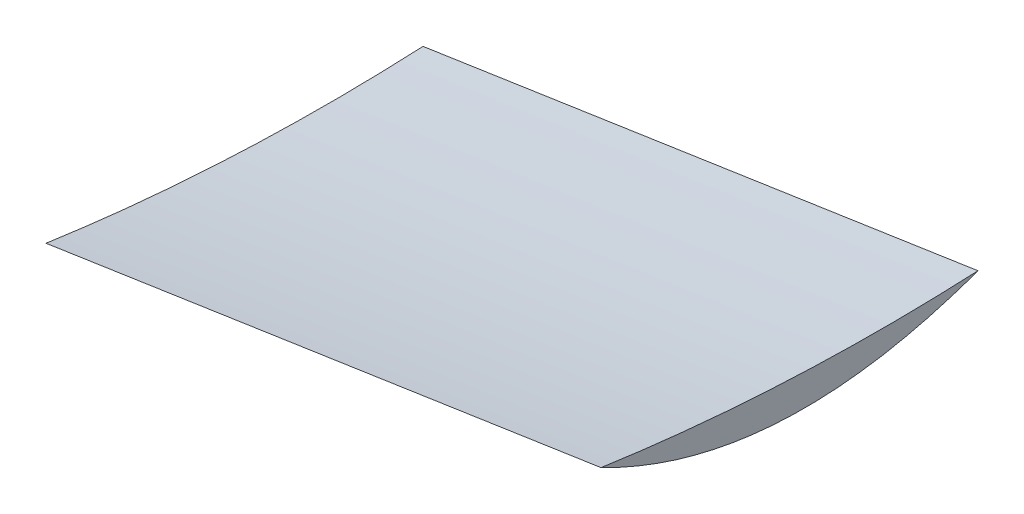
ISO-10303-21;
HEADER;
FILE_DESCRIPTION(('STEP AP214'),'2;1');
FILE_NAME('part.step','',(''),(''),'','','');
FILE_SCHEMA(('AUTOMOTIVE_DESIGN { 1 0 10303 214 1 1 1 1 }'));
ENDSEC;
DATA;
#1=APPLICATION_CONTEXT('core data for automotive mechanical design processes');
#2=APPLICATION_PROTOCOL_DEFINITION('international standard','automotive_design',2000,#1);
#3=PRODUCT_CONTEXT('',#1,'mechanical');
#4=PRODUCT('Part','Part','',(#3));
#5=PRODUCT_RELATED_PRODUCT_CATEGORY('part','',(#4));
#6=PRODUCT_DEFINITION_FORMATION('','',#4);
#7=PRODUCT_DEFINITION_CONTEXT('part definition',#1,'design');
#8=PRODUCT_DEFINITION('design','',#6,#7);
#9=PRODUCT_DEFINITION_SHAPE('','',#8);
#10=(LENGTH_UNIT() NAMED_UNIT(*) SI_UNIT(.MILLI.,.METRE.));
#11=(NAMED_UNIT(*) PLANE_ANGLE_UNIT() SI_UNIT($,.RADIAN.));
#12=(NAMED_UNIT(*) SI_UNIT($,.STERADIAN.) SOLID_ANGLE_UNIT());
#13=UNCERTAINTY_MEASURE_WITH_UNIT(LENGTH_MEASURE(1.E-05),#10,'distance_accuracy_value','');
#14=(GEOMETRIC_REPRESENTATION_CONTEXT(3) GLOBAL_UNCERTAINTY_ASSIGNED_CONTEXT((#13)) GLOBAL_UNIT_ASSIGNED_CONTEXT((#10,
#11,#12)) REPRESENTATION_CONTEXT('',''));
#15=CARTESIAN_POINT('',(0.,0.,0.));
#16=DIRECTION('',(0.,0.,1.));
#17=DIRECTION('',(1.,0.,0.));
#18=AXIS2_PLACEMENT_3D('',#15,#16,#17);
#19=CARTESIAN_POINT('',(0.,-45.2467627871021,-200.725973618223));
#20=DIRECTION('',(-1.,0.,0.));
#21=DIRECTION('',(0.,0.,1.));
#22=AXIS2_PLACEMENT_3D('',#19,#20,#21);
#23=PLANE('',#22);
#24=CARTESIAN_POINT('',(0.,21.7249035442321,44.991742266569));
#25=CARTESIAN_POINT('',(0.,-100.101611133958,-192.732864503506));
#26=CARTESIAN_POINT('',(0.,-2.50873242472436,-462.429907732447));
#27=B_SPLINE_CURVE_WITH_KNOTS('',2,(#24,#25,#26),.UNSPECIFIED.,.F.,.F.,(3,3),(0.,1.),.UNSPECIFIED.);
#28=CARTESIAN_POINT('',(0.,21.7249035442321,44.991742266569));
#29=VERTEX_POINT('',#28);
#30=CARTESIAN_POINT('',(0.,-2.50873242472436,-462.429907732447));
#31=VERTEX_POINT('',#30);
#32=EDGE_CURVE('E60',#29,#31,#27,.T.);
#33=ORIENTED_EDGE('',*,*,#32,.T.);
#34=CARTESIAN_POINT('',(0.,-2.50873242472436,-462.429907732447));
#35=CARTESIAN_POINT('',(0.,-14.7483963263263,-207.26584403443));
#36=CARTESIAN_POINT('',(0.,21.7249035442321,44.991742266569));
#37=B_SPLINE_CURVE_WITH_KNOTS('',2,(#34,#35,#36),.UNSPECIFIED.,.F.,.F.,(3,3),(0.,1.),.UNSPECIFIED.);
#38=EDGE_CURVE('E65',#31,#29,#37,.T.);
#39=ORIENTED_EDGE('',*,*,#38,.T.);
#40=EDGE_LOOP('',(#33,#39));
#41=FACE_BOUND('',#40,.T.);
#42=ADVANCED_FACE('F32',(#41),#23,.F.);
#43=CARTESIAN_POINT('',(-635.,-45.2467627871021,-88.7583408683493));
#44=DIRECTION('',(-1.,0.,0.));
#45=DIRECTION('',(0.,0.,1.));
#46=AXIS2_PLACEMENT_3D('',#43,#44,#45);
#47=PLANE('',#46);
#48=CARTESIAN_POINT('',(-635.,21.7249035442321,156.959375016442));
#49=CARTESIAN_POINT('',(-635.,-100.101611133958,-80.7652317536329));
#50=CARTESIAN_POINT('',(-635.,-2.50873242472436,-350.462274982574));
#51=B_SPLINE_CURVE_WITH_KNOTS('',2,(#48,#49,#50),.UNSPECIFIED.,.F.,.F.,(3,3),(0.,1.),.UNSPECIFIED.);
#52=CARTESIAN_POINT('',(-635.,21.7249035442321,156.959375016442));
#53=VERTEX_POINT('',#52);
#54=CARTESIAN_POINT('',(-635.,-2.50873242472436,-350.462274982574));
#55=VERTEX_POINT('',#54);
#56=EDGE_CURVE('E48',#53,#55,#51,.T.);
#57=ORIENTED_EDGE('',*,*,#56,.F.);
#58=CARTESIAN_POINT('',(-635.,-2.50873242472436,-350.462274982574));
#59=CARTESIAN_POINT('',(-635.,-14.7483963263263,-95.2982112845566));
#60=CARTESIAN_POINT('',(-635.,21.7249035442321,156.959375016442));
#61=B_SPLINE_CURVE_WITH_KNOTS('',2,(#58,#59,#60),.UNSPECIFIED.,.F.,.F.,(3,3),(0.,1.),.UNSPECIFIED.);
#62=EDGE_CURVE('E11',#55,#53,#61,.T.);
#63=ORIENTED_EDGE('',*,*,#62,.F.);
#64=EDGE_LOOP('',(#57,#63));
#65=FACE_BOUND('',#64,.T.);
#66=ADVANCED_FACE('F91',(#65),#47,.T.);
#67=CARTESIAN_POINT('',(0.,21.7249035442321,44.991742266569));
#68=CARTESIAN_POINT('',(-635.,21.7249035442321,156.959375016442));
#69=CARTESIAN_POINT('',(0.,-100.101611133958,-192.732864503506));
#70=CARTESIAN_POINT('',(-635.,-100.101611133958,-80.7652317536329));
#71=CARTESIAN_POINT('',(0.,-2.50873242472436,-462.429907732447));
#72=CARTESIAN_POINT('',(-635.,-2.50873242472436,-350.462274982574));
#73=B_SPLINE_SURFACE_WITH_KNOTS('',2,1,((#67,#68),(#69,#70),(#71,#72)),.UNSPECIFIED.,.F.,.F.,
.F.,(3,3),(2,2),(0.,1.),(0.,1.),.UNSPECIFIED.);
#74=DIRECTION('',(-0.984807753012209,0.,0.173648177666927));
#75=VECTOR('',#74,1.);
#76=CARTESIAN_POINT('',(0.,-2.50873242472436,-462.429907732447));
#77=LINE('',#76,#75);
#78=EDGE_CURVE('E41',#31,#55,#77,.T.);
#79=DIRECTION('',(-0.984807753012209,0.,0.173648177666927));
#80=VECTOR('',#79,1.);
#81=CARTESIAN_POINT('',(0.,21.7249035442321,44.991742266569));
#82=LINE('',#81,#80);
#83=EDGE_CURVE('E63',#29,#53,#82,.T.);
#84=ORIENTED_EDGE('',*,*,#78,.F.);
#85=ORIENTED_EDGE('',*,*,#32,.F.);
#86=ORIENTED_EDGE('',*,*,#83,.T.);
#87=ORIENTED_EDGE('',*,*,#56,.T.);
#88=EDGE_LOOP('',(#84,#85,#86,#87));
#89=FACE_BOUND('',#88,.T.);
#90=ADVANCED_FACE('F62',(#89),#73,.F.);
#91=CARTESIAN_POINT('',(0.,-2.50873242472436,-462.429907732447));
#92=CARTESIAN_POINT('',(-635.,-2.50873242472436,-350.462274982574));
#93=CARTESIAN_POINT('',(0.,-14.7483963263263,-207.26584403443));
#94=CARTESIAN_POINT('',(-635.,-14.7483963263263,-95.2982112845565));
#95=CARTESIAN_POINT('',(0.,21.7249035442321,44.991742266569));
#96=CARTESIAN_POINT('',(-635.,21.7249035442321,156.959375016442));
#97=B_SPLINE_SURFACE_WITH_KNOTS('',2,1,((#91,#92),(#93,#94),(#95,#96)),.UNSPECIFIED.,.F.,.F.,
.F.,(3,3),(2,2),(0.,1.),(0.,1.),.UNSPECIFIED.);
#98=ORIENTED_EDGE('',*,*,#62,.T.);
#99=ORIENTED_EDGE('',*,*,#83,.F.);
#100=ORIENTED_EDGE('',*,*,#38,.F.);
#101=ORIENTED_EDGE('',*,*,#78,.T.);
#102=EDGE_LOOP('',(#98,#99,#100,#101));
#103=FACE_BOUND('',#102,.T.);
#104=ADVANCED_FACE('F67',(#103),#97,.F.);
#105=CLOSED_SHELL('',(#42,#66,#90,#104));
#106=MANIFOLD_SOLID_BREP('B2',#105);
#107=ADVANCED_BREP_SHAPE_REPRESENTATION('',(#18,#106),#14);
#108=SHAPE_DEFINITION_REPRESENTATION(#9,#107);
ENDSEC;
END-ISO-10303-21;
